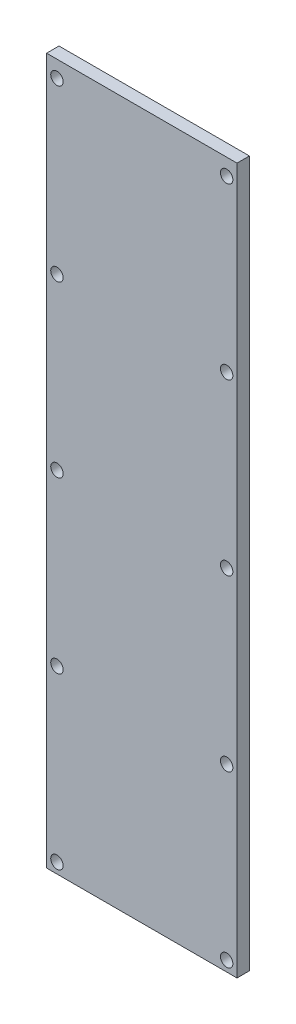
ISO-10303-21;
HEADER;
FILE_DESCRIPTION(('STEP AP214'),'2;1');
FILE_NAME('part.step','',(''),(''),'','','');
FILE_SCHEMA(('AUTOMOTIVE_DESIGN { 1 0 10303 214 1 1 1 1 }'));
ENDSEC;
DATA;
#1=APPLICATION_CONTEXT('core data for automotive mechanical design processes');
#2=APPLICATION_PROTOCOL_DEFINITION('international standard','automotive_design',2000,#1);
#3=PRODUCT_CONTEXT('',#1,'mechanical');
#4=PRODUCT('Part','Part','',(#3));
#5=PRODUCT_RELATED_PRODUCT_CATEGORY('part','',(#4));
#6=PRODUCT_DEFINITION_FORMATION('','',#4);
#7=PRODUCT_DEFINITION_CONTEXT('part definition',#1,'design');
#8=PRODUCT_DEFINITION('design','',#6,#7);
#9=PRODUCT_DEFINITION_SHAPE('','',#8);
#10=(LENGTH_UNIT() NAMED_UNIT(*) SI_UNIT(.MILLI.,.METRE.));
#11=(NAMED_UNIT(*) PLANE_ANGLE_UNIT() SI_UNIT($,.RADIAN.));
#12=(NAMED_UNIT(*) SI_UNIT($,.STERADIAN.) SOLID_ANGLE_UNIT());
#13=UNCERTAINTY_MEASURE_WITH_UNIT(LENGTH_MEASURE(1.E-05),#10,'distance_accuracy_value','');
#14=(GEOMETRIC_REPRESENTATION_CONTEXT(3) GLOBAL_UNCERTAINTY_ASSIGNED_CONTEXT((#13)) GLOBAL_UNIT_ASSIGNED_CONTEXT((#10,
#11,#12)) REPRESENTATION_CONTEXT('',''));
#15=CARTESIAN_POINT('',(0.,0.,0.));
#16=DIRECTION('',(0.,0.,1.));
#17=DIRECTION('',(1.,0.,0.));
#18=AXIS2_PLACEMENT_3D('',#15,#16,#17);
#19=CARTESIAN_POINT('',(0.,0.,0.));
#20=DIRECTION('',(0.,0.,1.));
#21=DIRECTION('',(1.,0.,0.));
#22=AXIS2_PLACEMENT_3D('',#19,#20,#21);
#23=PLANE('',#22);
#24=DIRECTION('',(1.,0.,0.));
#25=VECTOR('',#24,1.);
#26=CARTESIAN_POINT('',(0.,-13.,0.));
#27=LINE('',#26,#25);
#28=CARTESIAN_POINT('',(-40.,-13.,0.));
#29=VERTEX_POINT('',#28);
#30=CARTESIAN_POINT('',(6.,-13.,0.));
#31=VERTEX_POINT('',#30);
#32=EDGE_CURVE('E247',#29,#31,#27,.T.);
#33=ORIENTED_EDGE('',*,*,#32,.F.);
#34=DIRECTION('',(0.,1.,0.));
#35=VECTOR('',#34,1.);
#36=CARTESIAN_POINT('',(-40.,0.,0.));
#37=LINE('',#36,#35);
#38=CARTESIAN_POINT('',(-40.,157.5,0.));
#39=VERTEX_POINT('',#38);
#40=EDGE_CURVE('E179',#29,#39,#37,.T.);
#41=ORIENTED_EDGE('',*,*,#40,.T.);
#42=DIRECTION('',(1.,0.,0.));
#43=VECTOR('',#42,1.);
#44=CARTESIAN_POINT('',(0.,157.5,0.));
#45=LINE('',#44,#43);
#46=CARTESIAN_POINT('',(6.,157.5,0.));
#47=VERTEX_POINT('',#46);
#48=EDGE_CURVE('E253',#39,#47,#45,.T.);
#49=ORIENTED_EDGE('',*,*,#48,.T.);
#50=DIRECTION('',(0.,1.,0.));
#51=VECTOR('',#50,1.);
#52=CARTESIAN_POINT('',(6.,0.,0.));
#53=LINE('',#52,#51);
#54=EDGE_CURVE('E250',#31,#47,#53,.T.);
#55=ORIENTED_EDGE('',*,*,#54,.F.);
#56=EDGE_LOOP('',(#33,#41,#49,#55));
#57=FACE_BOUND('',#56,.T.);
#58=CARTESIAN_POINT('',(-37.5,-10.5000000000003,0.));
#59=DIRECTION('',(0.,0.,1.));
#60=DIRECTION('',(1.,0.,0.));
#61=AXIS2_PLACEMENT_3D('',#58,#59,#60);
#62=CIRCLE('',#61,1.5);
#63=CARTESIAN_POINT('',(-36.,-10.5000000000003,0.));
#64=VERTEX_POINT('',#63);
#65=EDGE_CURVE('E244',#64,#64,#62,.T.);
#66=ORIENTED_EDGE('',*,*,#65,.T.);
#67=EDGE_LOOP('',(#66));
#68=FACE_BOUND('',#67,.T.);
#69=CARTESIAN_POINT('',(3.5,-10.5000000000003,0.));
#70=DIRECTION('',(0.,0.,1.));
#71=DIRECTION('',(1.,0.,0.));
#72=AXIS2_PLACEMENT_3D('',#69,#70,#71);
#73=CIRCLE('',#72,1.5);
#74=CARTESIAN_POINT('',(5.00000000000001,-10.5000000000003,0.));
#75=VERTEX_POINT('',#74);
#76=EDGE_CURVE('E241',#75,#75,#73,.T.);
#77=ORIENTED_EDGE('',*,*,#76,.T.);
#78=EDGE_LOOP('',(#77));
#79=FACE_BOUND('',#78,.T.);
#80=CARTESIAN_POINT('',(3.49999999999986,30.4999999999997,0.));
#81=DIRECTION('',(0.,0.,1.));
#82=DIRECTION('',(1.,0.,0.));
#83=AXIS2_PLACEMENT_3D('',#80,#81,#82);
#84=CIRCLE('',#83,1.5);
#85=CARTESIAN_POINT('',(4.99999999999986,30.4999999999997,0.));
#86=VERTEX_POINT('',#85);
#87=EDGE_CURVE('E238',#86,#86,#84,.T.);
#88=ORIENTED_EDGE('',*,*,#87,.T.);
#89=EDGE_LOOP('',(#88));
#90=FACE_BOUND('',#89,.T.);
#91=CARTESIAN_POINT('',(3.49999999999972,71.4999999999997,0.));
#92=DIRECTION('',(0.,0.,1.));
#93=DIRECTION('',(1.,0.,0.));
#94=AXIS2_PLACEMENT_3D('',#91,#92,#93);
#95=CIRCLE('',#94,1.5);
#96=CARTESIAN_POINT('',(4.99999999999972,71.4999999999997,0.));
#97=VERTEX_POINT('',#96);
#98=EDGE_CURVE('E235',#97,#97,#95,.T.);
#99=ORIENTED_EDGE('',*,*,#98,.T.);
#100=EDGE_LOOP('',(#99));
#101=FACE_BOUND('',#100,.T.);
#102=CARTESIAN_POINT('',(3.49999999999957,112.5,0.));
#103=DIRECTION('',(0.,0.,1.));
#104=DIRECTION('',(1.,0.,0.));
#105=AXIS2_PLACEMENT_3D('',#102,#103,#104);
#106=CIRCLE('',#105,1.5);
#107=CARTESIAN_POINT('',(4.99999999999958,112.5,0.));
#108=VERTEX_POINT('',#107);
#109=EDGE_CURVE('E232',#108,#108,#106,.T.);
#110=ORIENTED_EDGE('',*,*,#109,.T.);
#111=EDGE_LOOP('',(#110));
#112=FACE_BOUND('',#111,.T.);
#113=CARTESIAN_POINT('',(3.49999999999943,153.5,0.));
#114=DIRECTION('',(0.,0.,1.));
#115=DIRECTION('',(1.,0.,0.));
#116=AXIS2_PLACEMENT_3D('',#113,#114,#115);
#117=CIRCLE('',#116,1.5);
#118=CARTESIAN_POINT('',(4.99999999999943,153.5,0.));
#119=VERTEX_POINT('',#118);
#120=EDGE_CURVE('E229',#119,#119,#117,.T.);
#121=ORIENTED_EDGE('',*,*,#120,.T.);
#122=EDGE_LOOP('',(#121));
#123=FACE_BOUND('',#122,.T.);
#124=CARTESIAN_POINT('',(-37.5000000000001,30.4999999999997,0.));
#125=DIRECTION('',(0.,0.,1.));
#126=DIRECTION('',(1.,0.,0.));
#127=AXIS2_PLACEMENT_3D('',#124,#125,#126);
#128=CIRCLE('',#127,1.5);
#129=CARTESIAN_POINT('',(-36.0000000000001,30.4999999999997,0.));
#130=VERTEX_POINT('',#129);
#131=EDGE_CURVE('E226',#130,#130,#128,.T.);
#132=ORIENTED_EDGE('',*,*,#131,.T.);
#133=EDGE_LOOP('',(#132));
#134=FACE_BOUND('',#133,.T.);
#135=CARTESIAN_POINT('',(-37.5000000000003,71.4999999999997,0.));
#136=DIRECTION('',(0.,0.,1.));
#137=DIRECTION('',(1.,0.,0.));
#138=AXIS2_PLACEMENT_3D('',#135,#136,#137);
#139=CIRCLE('',#138,1.5);
#140=CARTESIAN_POINT('',(-36.0000000000003,71.4999999999997,0.));
#141=VERTEX_POINT('',#140);
#142=EDGE_CURVE('E223',#141,#141,#139,.T.);
#143=ORIENTED_EDGE('',*,*,#142,.T.);
#144=EDGE_LOOP('',(#143));
#145=FACE_BOUND('',#144,.T.);
#146=CARTESIAN_POINT('',(-37.5000000000004,112.5,0.));
#147=DIRECTION('',(0.,0.,1.));
#148=DIRECTION('',(1.,0.,0.));
#149=AXIS2_PLACEMENT_3D('',#146,#147,#148);
#150=CIRCLE('',#149,1.5);
#151=CARTESIAN_POINT('',(-36.0000000000004,112.5,0.));
#152=VERTEX_POINT('',#151);
#153=EDGE_CURVE('E220',#152,#152,#150,.T.);
#154=ORIENTED_EDGE('',*,*,#153,.T.);
#155=EDGE_LOOP('',(#154));
#156=FACE_BOUND('',#155,.T.);
#157=CARTESIAN_POINT('',(-37.5000000000006,153.5,0.));
#158=DIRECTION('',(0.,0.,1.));
#159=DIRECTION('',(1.,0.,0.));
#160=AXIS2_PLACEMENT_3D('',#157,#158,#159);
#161=CIRCLE('',#160,1.5);
#162=CARTESIAN_POINT('',(-36.0000000000006,153.5,0.));
#163=VERTEX_POINT('',#162);
#164=EDGE_CURVE('E162',#163,#163,#161,.T.);
#165=ORIENTED_EDGE('',*,*,#164,.T.);
#166=EDGE_LOOP('',(#165));
#167=FACE_BOUND('',#166,.T.);
#168=DIRECTION('',(-1.,0.,0.));
#169=VECTOR('',#168,1.);
#170=CARTESIAN_POINT('',(0.,-8.,0.));
#171=LINE('',#170,#169);
#172=CARTESIAN_POINT('',(1.,-8.,0.));
#173=VERTEX_POINT('',#172);
#174=CARTESIAN_POINT('',(-35.,-8.,0.));
#175=VERTEX_POINT('',#174);
#176=EDGE_CURVE('E11',#173,#175,#171,.T.);
#177=ORIENTED_EDGE('',*,*,#176,.F.);
#178=DIRECTION('',(0.,1.,0.));
#179=VECTOR('',#178,1.);
#180=CARTESIAN_POINT('',(1.,0.,0.));
#181=LINE('',#180,#179);
#182=CARTESIAN_POINT('',(1.,152.5,0.));
#183=VERTEX_POINT('',#182);
#184=EDGE_CURVE('E127',#173,#183,#181,.T.);
#185=ORIENTED_EDGE('',*,*,#184,.T.);
#186=DIRECTION('',(-1.,0.,0.));
#187=VECTOR('',#186,1.);
#188=CARTESIAN_POINT('',(0.,152.5,0.));
#189=LINE('',#188,#187);
#190=CARTESIAN_POINT('',(-35.,152.5,0.));
#191=VERTEX_POINT('',#190);
#192=EDGE_CURVE('E277',#183,#191,#189,.T.);
#193=ORIENTED_EDGE('',*,*,#192,.T.);
#194=DIRECTION('',(0.,1.,0.));
#195=VECTOR('',#194,1.);
#196=CARTESIAN_POINT('',(-35.,0.,0.));
#197=LINE('',#196,#195);
#198=EDGE_CURVE('E43',#175,#191,#197,.T.);
#199=ORIENTED_EDGE('',*,*,#198,.F.);
#200=EDGE_LOOP('',(#177,#185,#193,#199));
#201=FACE_BOUND('',#200,.T.);
#202=ADVANCED_FACE('F35',(#57,#68,#79,#90,#101,#112,#123,#134,#145,#156,#167,#201),#23,.F.);
#203=CARTESIAN_POINT('',(0.,-13.,3.));
#204=DIRECTION('',(0.,1.,0.));
#205=DIRECTION('',(0.,0.,1.));
#206=AXIS2_PLACEMENT_3D('',#203,#204,#205);
#207=PLANE('',#206);
#208=ORIENTED_EDGE('',*,*,#32,.T.);
#209=DIRECTION('',(0.,0.,-1.));
#210=VECTOR('',#209,1.);
#211=CARTESIAN_POINT('',(6.,-13.,3.));
#212=LINE('',#211,#210);
#213=CARTESIAN_POINT('',(6.,-13.,3.));
#214=VERTEX_POINT('',#213);
#215=EDGE_CURVE('E263',#214,#31,#212,.T.);
#216=ORIENTED_EDGE('',*,*,#215,.F.);
#217=DIRECTION('',(1.,0.,0.));
#218=VECTOR('',#217,1.);
#219=CARTESIAN_POINT('',(0.,-13.,3.));
#220=LINE('',#219,#218);
#221=CARTESIAN_POINT('',(-40.,-13.,3.));
#222=VERTEX_POINT('',#221);
#223=EDGE_CURVE('E206',#222,#214,#220,.T.);
#224=ORIENTED_EDGE('',*,*,#223,.F.);
#225=DIRECTION('',(0.,0.,-1.));
#226=VECTOR('',#225,1.);
#227=CARTESIAN_POINT('',(-40.,-13.,3.));
#228=LINE('',#227,#226);
#229=EDGE_CURVE('E217',#222,#29,#228,.T.);
#230=ORIENTED_EDGE('',*,*,#229,.T.);
#231=EDGE_LOOP('',(#208,#216,#224,#230));
#232=FACE_BOUND('',#231,.T.);
#233=ADVANCED_FACE('F287',(#232),#207,.F.);
#234=CARTESIAN_POINT('',(6.,0.,3.));
#235=DIRECTION('',(-1.,0.,0.));
#236=DIRECTION('',(0.,0.,1.));
#237=AXIS2_PLACEMENT_3D('',#234,#235,#236);
#238=PLANE('',#237);
#239=ORIENTED_EDGE('',*,*,#54,.T.);
#240=DIRECTION('',(0.,0.,-1.));
#241=VECTOR('',#240,1.);
#242=CARTESIAN_POINT('',(6.,157.5,3.));
#243=LINE('',#242,#241);
#244=CARTESIAN_POINT('',(6.,157.5,3.));
#245=VERTEX_POINT('',#244);
#246=EDGE_CURVE('E261',#245,#47,#243,.T.);
#247=ORIENTED_EDGE('',*,*,#246,.F.);
#248=DIRECTION('',(0.,1.,0.));
#249=VECTOR('',#248,1.);
#250=CARTESIAN_POINT('',(6.,0.,3.));
#251=LINE('',#250,#249);
#252=EDGE_CURVE('E209',#214,#245,#251,.T.);
#253=ORIENTED_EDGE('',*,*,#252,.F.);
#254=ORIENTED_EDGE('',*,*,#215,.T.);
#255=EDGE_LOOP('',(#239,#247,#253,#254));
#256=FACE_BOUND('',#255,.T.);
#257=ADVANCED_FACE('F294',(#256),#238,.F.);
#258=CARTESIAN_POINT('',(0.,157.5,3.));
#259=DIRECTION('',(0.,1.,0.));
#260=DIRECTION('',(0.,0.,1.));
#261=AXIS2_PLACEMENT_3D('',#258,#259,#260);
#262=PLANE('',#261);
#263=ORIENTED_EDGE('',*,*,#48,.F.);
#264=DIRECTION('',(0.,0.,-1.));
#265=VECTOR('',#264,1.);
#266=CARTESIAN_POINT('',(-40.,157.5,3.));
#267=LINE('',#266,#265);
#268=CARTESIAN_POINT('',(-40.,157.5,3.));
#269=VERTEX_POINT('',#268);
#270=EDGE_CURVE('E259',#269,#39,#267,.T.);
#271=ORIENTED_EDGE('',*,*,#270,.F.);
#272=DIRECTION('',(1.,0.,0.));
#273=VECTOR('',#272,1.);
#274=CARTESIAN_POINT('',(0.,157.5,3.));
#275=LINE('',#274,#273);
#276=EDGE_CURVE('E211',#269,#245,#275,.T.);
#277=ORIENTED_EDGE('',*,*,#276,.T.);
#278=ORIENTED_EDGE('',*,*,#246,.T.);
#279=EDGE_LOOP('',(#263,#271,#277,#278));
#280=FACE_BOUND('',#279,.T.);
#281=ADVANCED_FACE('F411',(#280),#262,.T.);
#282=CARTESIAN_POINT('',(-37.5,-10.5000000000003,3.));
#283=DIRECTION('',(0.,0.,-1.));
#284=DIRECTION('',(-1.,0.,0.));
#285=AXIS2_PLACEMENT_3D('',#282,#283,#284);
#286=CYLINDRICAL_SURFACE('',#285,1.5);
#287=CARTESIAN_POINT('',(-37.5,-10.5000000000003,3.));
#288=DIRECTION('',(0.,0.,1.));
#289=DIRECTION('',(1.,0.,0.));
#290=AXIS2_PLACEMENT_3D('',#287,#288,#289);
#291=CIRCLE('',#290,1.5);
#292=CARTESIAN_POINT('',(-36.,-10.5000000000003,3.));
#293=VERTEX_POINT('',#292);
#294=EDGE_CURVE('E203',#293,#293,#291,.T.);
#295=ORIENTED_EDGE('',*,*,#294,.T.);
#296=EDGE_LOOP('',(#295));
#297=FACE_BOUND('',#296,.T.);
#298=ORIENTED_EDGE('',*,*,#65,.F.);
#299=EDGE_LOOP('',(#298));
#300=FACE_BOUND('',#299,.T.);
#301=ADVANCED_FACE('F408',(#297,#300),#286,.F.);
#302=CARTESIAN_POINT('',(3.5,-10.5000000000003,3.));
#303=DIRECTION('',(0.,0.,-1.));
#304=DIRECTION('',(-1.,0.,0.));
#305=AXIS2_PLACEMENT_3D('',#302,#303,#304);
#306=CYLINDRICAL_SURFACE('',#305,1.5);
#307=CARTESIAN_POINT('',(3.5,-10.5000000000003,3.));
#308=DIRECTION('',(0.,0.,1.));
#309=DIRECTION('',(1.,0.,0.));
#310=AXIS2_PLACEMENT_3D('',#307,#308,#309);
#311=CIRCLE('',#310,1.5);
#312=CARTESIAN_POINT('',(5.00000000000001,-10.5000000000003,3.));
#313=VERTEX_POINT('',#312);
#314=EDGE_CURVE('E200',#313,#313,#311,.T.);
#315=ORIENTED_EDGE('',*,*,#314,.T.);
#316=EDGE_LOOP('',(#315));
#317=FACE_BOUND('',#316,.T.);
#318=ORIENTED_EDGE('',*,*,#76,.F.);
#319=EDGE_LOOP('',(#318));
#320=FACE_BOUND('',#319,.T.);
#321=ADVANCED_FACE('F404',(#317,#320),#306,.F.);
#322=CARTESIAN_POINT('',(3.49999999999986,30.4999999999997,3.));
#323=DIRECTION('',(0.,0.,-1.));
#324=DIRECTION('',(-1.,0.,0.));
#325=AXIS2_PLACEMENT_3D('',#322,#323,#324);
#326=CYLINDRICAL_SURFACE('',#325,1.5);
#327=CARTESIAN_POINT('',(3.49999999999986,30.4999999999997,3.));
#328=DIRECTION('',(0.,0.,1.));
#329=DIRECTION('',(1.,0.,0.));
#330=AXIS2_PLACEMENT_3D('',#327,#328,#329);
#331=CIRCLE('',#330,1.5);
#332=CARTESIAN_POINT('',(4.99999999999986,30.4999999999997,3.));
#333=VERTEX_POINT('',#332);
#334=EDGE_CURVE('E197',#333,#333,#331,.T.);
#335=ORIENTED_EDGE('',*,*,#334,.T.);
#336=EDGE_LOOP('',(#335));
#337=FACE_BOUND('',#336,.T.);
#338=ORIENTED_EDGE('',*,*,#87,.F.);
#339=EDGE_LOOP('',(#338));
#340=FACE_BOUND('',#339,.T.);
#341=ADVANCED_FACE('F400',(#337,#340),#326,.F.);
#342=CARTESIAN_POINT('',(3.49999999999972,71.4999999999997,3.));
#343=DIRECTION('',(0.,0.,-1.));
#344=DIRECTION('',(-1.,0.,0.));
#345=AXIS2_PLACEMENT_3D('',#342,#343,#344);
#346=CYLINDRICAL_SURFACE('',#345,1.5);
#347=CARTESIAN_POINT('',(3.49999999999972,71.4999999999997,3.));
#348=DIRECTION('',(0.,0.,1.));
#349=DIRECTION('',(1.,0.,0.));
#350=AXIS2_PLACEMENT_3D('',#347,#348,#349);
#351=CIRCLE('',#350,1.5);
#352=CARTESIAN_POINT('',(4.99999999999972,71.4999999999997,3.));
#353=VERTEX_POINT('',#352);
#354=EDGE_CURVE('E194',#353,#353,#351,.T.);
#355=ORIENTED_EDGE('',*,*,#354,.T.);
#356=EDGE_LOOP('',(#355));
#357=FACE_BOUND('',#356,.T.);
#358=ORIENTED_EDGE('',*,*,#98,.F.);
#359=EDGE_LOOP('',(#358));
#360=FACE_BOUND('',#359,.T.);
#361=ADVANCED_FACE('F396',(#357,#360),#346,.F.);
#362=CARTESIAN_POINT('',(3.49999999999957,112.5,3.));
#363=DIRECTION('',(0.,0.,-1.));
#364=DIRECTION('',(-1.,0.,0.));
#365=AXIS2_PLACEMENT_3D('',#362,#363,#364);
#366=CYLINDRICAL_SURFACE('',#365,1.5);
#367=CARTESIAN_POINT('',(3.49999999999957,112.5,3.));
#368=DIRECTION('',(0.,0.,1.));
#369=DIRECTION('',(1.,0.,0.));
#370=AXIS2_PLACEMENT_3D('',#367,#368,#369);
#371=CIRCLE('',#370,1.5);
#372=CARTESIAN_POINT('',(4.99999999999958,112.5,3.));
#373=VERTEX_POINT('',#372);
#374=EDGE_CURVE('E191',#373,#373,#371,.T.);
#375=ORIENTED_EDGE('',*,*,#374,.T.);
#376=EDGE_LOOP('',(#375));
#377=FACE_BOUND('',#376,.T.);
#378=ORIENTED_EDGE('',*,*,#109,.F.);
#379=EDGE_LOOP('',(#378));
#380=FACE_BOUND('',#379,.T.);
#381=ADVANCED_FACE('F392',(#377,#380),#366,.F.);
#382=CARTESIAN_POINT('',(3.49999999999943,153.5,3.));
#383=DIRECTION('',(0.,0.,-1.));
#384=DIRECTION('',(-1.,0.,0.));
#385=AXIS2_PLACEMENT_3D('',#382,#383,#384);
#386=CYLINDRICAL_SURFACE('',#385,1.5);
#387=CARTESIAN_POINT('',(3.49999999999943,153.5,3.));
#388=DIRECTION('',(0.,0.,1.));
#389=DIRECTION('',(1.,0.,0.));
#390=AXIS2_PLACEMENT_3D('',#387,#388,#389);
#391=CIRCLE('',#390,1.5);
#392=CARTESIAN_POINT('',(4.99999999999943,153.5,3.));
#393=VERTEX_POINT('',#392);
#394=EDGE_CURVE('E188',#393,#393,#391,.T.);
#395=ORIENTED_EDGE('',*,*,#394,.T.);
#396=EDGE_LOOP('',(#395));
#397=FACE_BOUND('',#396,.T.);
#398=ORIENTED_EDGE('',*,*,#120,.F.);
#399=EDGE_LOOP('',(#398));
#400=FACE_BOUND('',#399,.T.);
#401=ADVANCED_FACE('F388',(#397,#400),#386,.F.);
#402=CARTESIAN_POINT('',(-37.5000000000001,30.4999999999997,3.));
#403=DIRECTION('',(0.,0.,-1.));
#404=DIRECTION('',(-1.,0.,0.));
#405=AXIS2_PLACEMENT_3D('',#402,#403,#404);
#406=CYLINDRICAL_SURFACE('',#405,1.5);
#407=CARTESIAN_POINT('',(-37.5000000000001,30.4999999999997,3.));
#408=DIRECTION('',(0.,0.,1.));
#409=DIRECTION('',(1.,0.,0.));
#410=AXIS2_PLACEMENT_3D('',#407,#408,#409);
#411=CIRCLE('',#410,1.5);
#412=CARTESIAN_POINT('',(-36.0000000000001,30.4999999999997,3.));
#413=VERTEX_POINT('',#412);
#414=EDGE_CURVE('E185',#413,#413,#411,.T.);
#415=ORIENTED_EDGE('',*,*,#414,.T.);
#416=EDGE_LOOP('',(#415));
#417=FACE_BOUND('',#416,.T.);
#418=ORIENTED_EDGE('',*,*,#131,.F.);
#419=EDGE_LOOP('',(#418));
#420=FACE_BOUND('',#419,.T.);
#421=ADVANCED_FACE('F381',(#417,#420),#406,.F.);
#422=CARTESIAN_POINT('',(-37.5000000000003,71.4999999999997,3.));
#423=DIRECTION('',(0.,0.,-1.));
#424=DIRECTION('',(-1.,0.,0.));
#425=AXIS2_PLACEMENT_3D('',#422,#423,#424);
#426=CYLINDRICAL_SURFACE('',#425,1.5);
#427=CARTESIAN_POINT('',(-37.5000000000003,71.4999999999997,3.));
#428=DIRECTION('',(0.,0.,1.));
#429=DIRECTION('',(1.,0.,0.));
#430=AXIS2_PLACEMENT_3D('',#427,#428,#429);
#431=CIRCLE('',#430,1.5);
#432=CARTESIAN_POINT('',(-36.0000000000003,71.4999999999997,3.));
#433=VERTEX_POINT('',#432);
#434=EDGE_CURVE('E182',#433,#433,#431,.T.);
#435=ORIENTED_EDGE('',*,*,#434,.T.);
#436=EDGE_LOOP('',(#435));
#437=FACE_BOUND('',#436,.T.);
#438=ORIENTED_EDGE('',*,*,#142,.F.);
#439=EDGE_LOOP('',(#438));
#440=FACE_BOUND('',#439,.T.);
#441=ADVANCED_FACE('F376',(#437,#440),#426,.F.);
#442=CARTESIAN_POINT('',(-37.5000000000004,112.5,3.));
#443=DIRECTION('',(0.,0.,-1.));
#444=DIRECTION('',(-1.,0.,0.));
#445=AXIS2_PLACEMENT_3D('',#442,#443,#444);
#446=CYLINDRICAL_SURFACE('',#445,1.5);
#447=CARTESIAN_POINT('',(-37.5000000000004,112.5,3.));
#448=DIRECTION('',(0.,0.,1.));
#449=DIRECTION('',(1.,0.,0.));
#450=AXIS2_PLACEMENT_3D('',#447,#448,#449);
#451=CIRCLE('',#450,1.5);
#452=CARTESIAN_POINT('',(-36.0000000000004,112.5,3.));
#453=VERTEX_POINT('',#452);
#454=EDGE_CURVE('E178',#453,#453,#451,.T.);
#455=ORIENTED_EDGE('',*,*,#454,.T.);
#456=EDGE_LOOP('',(#455));
#457=FACE_BOUND('',#456,.T.);
#458=ORIENTED_EDGE('',*,*,#153,.F.);
#459=EDGE_LOOP('',(#458));
#460=FACE_BOUND('',#459,.T.);
#461=ADVANCED_FACE('F370',(#457,#460),#446,.F.);
#462=CARTESIAN_POINT('',(-37.5000000000006,153.5,3.));
#463=DIRECTION('',(0.,0.,-1.));
#464=DIRECTION('',(-1.,0.,0.));
#465=AXIS2_PLACEMENT_3D('',#462,#463,#464);
#466=CYLINDRICAL_SURFACE('',#465,1.5);
#467=CARTESIAN_POINT('',(-37.5000000000006,153.5,3.));
#468=DIRECTION('',(0.,0.,1.));
#469=DIRECTION('',(1.,0.,0.));
#470=AXIS2_PLACEMENT_3D('',#467,#468,#469);
#471=CIRCLE('',#470,1.5);
#472=CARTESIAN_POINT('',(-36.0000000000006,153.5,3.));
#473=VERTEX_POINT('',#472);
#474=EDGE_CURVE('E175',#473,#473,#471,.T.);
#475=ORIENTED_EDGE('',*,*,#474,.T.);
#476=EDGE_LOOP('',(#475));
#477=FACE_BOUND('',#476,.T.);
#478=ORIENTED_EDGE('',*,*,#164,.F.);
#479=EDGE_LOOP('',(#478));
#480=FACE_BOUND('',#479,.T.);
#481=ADVANCED_FACE('F37',(#477,#480),#466,.F.);
#482=CARTESIAN_POINT('',(-40.,0.,3.));
#483=DIRECTION('',(-1.,0.,0.));
#484=DIRECTION('',(0.,0.,1.));
#485=AXIS2_PLACEMENT_3D('',#482,#483,#484);
#486=PLANE('',#485);
#487=ORIENTED_EDGE('',*,*,#40,.F.);
#488=ORIENTED_EDGE('',*,*,#229,.F.);
#489=DIRECTION('',(0.,1.,0.));
#490=VECTOR('',#489,1.);
#491=CARTESIAN_POINT('',(-40.,0.,3.));
#492=LINE('',#491,#490);
#493=EDGE_CURVE('E214',#222,#269,#492,.T.);
#494=ORIENTED_EDGE('',*,*,#493,.T.);
#495=ORIENTED_EDGE('',*,*,#270,.T.);
#496=EDGE_LOOP('',(#487,#488,#494,#495));
#497=FACE_BOUND('',#496,.T.);
#498=ADVANCED_FACE('F338',(#497),#486,.T.);
#499=CARTESIAN_POINT('',(0.,0.,3.));
#500=DIRECTION('',(0.,0.,1.));
#501=DIRECTION('',(1.,0.,0.));
#502=AXIS2_PLACEMENT_3D('',#499,#500,#501);
#503=PLANE('',#502);
#504=ORIENTED_EDGE('',*,*,#223,.T.);
#505=ORIENTED_EDGE('',*,*,#252,.T.);
#506=ORIENTED_EDGE('',*,*,#276,.F.);
#507=ORIENTED_EDGE('',*,*,#493,.F.);
#508=EDGE_LOOP('',(#504,#505,#506,#507));
#509=FACE_BOUND('',#508,.T.);
#510=ORIENTED_EDGE('',*,*,#294,.F.);
#511=EDGE_LOOP('',(#510));
#512=FACE_BOUND('',#511,.T.);
#513=ORIENTED_EDGE('',*,*,#314,.F.);
#514=EDGE_LOOP('',(#513));
#515=FACE_BOUND('',#514,.T.);
#516=ORIENTED_EDGE('',*,*,#334,.F.);
#517=EDGE_LOOP('',(#516));
#518=FACE_BOUND('',#517,.T.);
#519=ORIENTED_EDGE('',*,*,#354,.F.);
#520=EDGE_LOOP('',(#519));
#521=FACE_BOUND('',#520,.T.);
#522=ORIENTED_EDGE('',*,*,#374,.F.);
#523=EDGE_LOOP('',(#522));
#524=FACE_BOUND('',#523,.T.);
#525=ORIENTED_EDGE('',*,*,#394,.F.);
#526=EDGE_LOOP('',(#525));
#527=FACE_BOUND('',#526,.T.);
#528=ORIENTED_EDGE('',*,*,#414,.F.);
#529=EDGE_LOOP('',(#528));
#530=FACE_BOUND('',#529,.T.);
#531=ORIENTED_EDGE('',*,*,#434,.F.);
#532=EDGE_LOOP('',(#531));
#533=FACE_BOUND('',#532,.T.);
#534=ORIENTED_EDGE('',*,*,#454,.F.);
#535=EDGE_LOOP('',(#534));
#536=FACE_BOUND('',#535,.T.);
#537=ORIENTED_EDGE('',*,*,#474,.F.);
#538=EDGE_LOOP('',(#537));
#539=FACE_BOUND('',#538,.T.);
#540=ADVANCED_FACE('F331',(#509,#512,#515,#518,#521,#524,#527,#530,#533,#536,#539),#503,.T.);
#541=CARTESIAN_POINT('',(0.,0.,-3.));
#542=DIRECTION('',(1.,0.,0.));
#543=DIRECTION('',(0.,0.,-1.));
#544=AXIS2_PLACEMENT_3D('',#541,#542,#543);
#545=PLANE('',#544);
#546=DIRECTION('',(0.,0.,1.));
#547=VECTOR('',#546,1.);
#548=CARTESIAN_POINT('',(0.,-7.,-3.));
#549=LINE('',#548,#547);
#550=CARTESIAN_POINT('',(0.,-7.,-3.));
#551=VERTEX_POINT('',#550);
#552=CARTESIAN_POINT('',(0.,-7.,0.));
#553=VERTEX_POINT('',#552);
#554=EDGE_CURVE('E167',#551,#553,#549,.T.);
#555=ORIENTED_EDGE('',*,*,#554,.T.);
#556=DIRECTION('',(0.,1.,0.));
#557=VECTOR('',#556,1.);
#558=CARTESIAN_POINT('',(0.,0.,0.));
#559=LINE('',#558,#557);
#560=CARTESIAN_POINT('',(0.,151.5,0.));
#561=VERTEX_POINT('',#560);
#562=EDGE_CURVE('E274',#553,#561,#559,.T.);
#563=ORIENTED_EDGE('',*,*,#562,.T.);
#564=DIRECTION('',(0.,0.,1.));
#565=VECTOR('',#564,1.);
#566=CARTESIAN_POINT('',(0.,151.5,-3.));
#567=LINE('',#566,#565);
#568=CARTESIAN_POINT('',(0.,151.5,-3.));
#569=VERTEX_POINT('',#568);
#570=EDGE_CURVE('E159',#569,#561,#567,.T.);
#571=ORIENTED_EDGE('',*,*,#570,.F.);
#572=DIRECTION('',(0.,1.,0.));
#573=VECTOR('',#572,1.);
#574=CARTESIAN_POINT('',(0.,0.,-3.));
#575=LINE('',#574,#573);
#576=EDGE_CURVE('E150',#551,#569,#575,.T.);
#577=ORIENTED_EDGE('',*,*,#576,.F.);
#578=EDGE_LOOP('',(#555,#563,#571,#577));
#579=FACE_BOUND('',#578,.T.);
#580=ADVANCED_FACE('F312',(#579),#545,.F.);
#581=CARTESIAN_POINT('',(0.,151.5,-3.));
#582=DIRECTION('',(0.,1.,0.));
#583=DIRECTION('',(0.,0.,1.));
#584=AXIS2_PLACEMENT_3D('',#581,#582,#583);
#585=PLANE('',#584);
#586=ORIENTED_EDGE('',*,*,#570,.T.);
#587=DIRECTION('',(-1.,0.,0.));
#588=VECTOR('',#587,1.);
#589=CARTESIAN_POINT('',(0.,151.5,0.));
#590=LINE('',#589,#588);
#591=CARTESIAN_POINT('',(-34.,151.5,0.));
#592=VERTEX_POINT('',#591);
#593=EDGE_CURVE('E272',#561,#592,#590,.T.);
#594=ORIENTED_EDGE('',*,*,#593,.T.);
#595=DIRECTION('',(0.,0.,1.));
#596=VECTOR('',#595,1.);
#597=CARTESIAN_POINT('',(-34.,151.5,-3.));
#598=LINE('',#597,#596);
#599=CARTESIAN_POINT('',(-34.,151.5,-3.));
#600=VERTEX_POINT('',#599);
#601=EDGE_CURVE('E163',#600,#592,#598,.T.);
#602=ORIENTED_EDGE('',*,*,#601,.F.);
#603=DIRECTION('',(-1.,0.,0.));
#604=VECTOR('',#603,1.);
#605=CARTESIAN_POINT('',(0.,151.5,-3.));
#606=LINE('',#605,#604);
#607=EDGE_CURVE('E130',#569,#600,#606,.T.);
#608=ORIENTED_EDGE('',*,*,#607,.F.);
#609=EDGE_LOOP('',(#586,#594,#602,#608));
#610=FACE_BOUND('',#609,.T.);
#611=ADVANCED_FACE('F315',(#610),#585,.F.);
#612=CARTESIAN_POINT('',(-34.,0.,-3.));
#613=DIRECTION('',(1.,0.,0.));
#614=DIRECTION('',(0.,0.,-1.));
#615=AXIS2_PLACEMENT_3D('',#612,#613,#614);
#616=PLANE('',#615);
#617=DIRECTION('',(0.,1.,0.));
#618=VECTOR('',#617,1.);
#619=CARTESIAN_POINT('',(-34.,0.,0.));
#620=LINE('',#619,#618);
#621=CARTESIAN_POINT('',(-34.,-7.,0.));
#622=VERTEX_POINT('',#621);
#623=EDGE_CURVE('E269',#622,#592,#620,.T.);
#624=ORIENTED_EDGE('',*,*,#623,.F.);
#625=DIRECTION('',(0.,0.,1.));
#626=VECTOR('',#625,1.);
#627=CARTESIAN_POINT('',(-34.,-7.,-3.));
#628=LINE('',#627,#626);
#629=CARTESIAN_POINT('',(-34.,-7.,-3.));
#630=VERTEX_POINT('',#629);
#631=EDGE_CURVE('E58',#630,#622,#628,.T.);
#632=ORIENTED_EDGE('',*,*,#631,.F.);
#633=DIRECTION('',(0.,1.,0.));
#634=VECTOR('',#633,1.);
#635=CARTESIAN_POINT('',(-34.,0.,-3.));
#636=LINE('',#635,#634);
#637=EDGE_CURVE('E155',#630,#600,#636,.T.);
#638=ORIENTED_EDGE('',*,*,#637,.T.);
#639=ORIENTED_EDGE('',*,*,#601,.T.);
#640=EDGE_LOOP('',(#624,#632,#638,#639));
#641=FACE_BOUND('',#640,.T.);
#642=ADVANCED_FACE('F327',(#641),#616,.T.);
#643=CARTESIAN_POINT('',(0.,-8.,-3.));
#644=DIRECTION('',(0.,1.,0.));
#645=DIRECTION('',(0.,0.,1.));
#646=AXIS2_PLACEMENT_3D('',#643,#644,#645);
#647=PLANE('',#646);
#648=DIRECTION('',(0.,0.,1.));
#649=VECTOR('',#648,1.);
#650=CARTESIAN_POINT('',(1.,-8.,-3.));
#651=LINE('',#650,#649);
#652=CARTESIAN_POINT('',(1.,-8.,-3.));
#653=VERTEX_POINT('',#652);
#654=EDGE_CURVE('E121',#653,#173,#651,.T.);
#655=ORIENTED_EDGE('',*,*,#654,.T.);
#656=ORIENTED_EDGE('',*,*,#176,.T.);
#657=DIRECTION('',(0.,0.,1.));
#658=VECTOR('',#657,1.);
#659=CARTESIAN_POINT('',(-35.,-8.,-3.));
#660=LINE('',#659,#658);
#661=CARTESIAN_POINT('',(-35.,-8.,-3.));
#662=VERTEX_POINT('',#661);
#663=EDGE_CURVE('E137',#662,#175,#660,.T.);
#664=ORIENTED_EDGE('',*,*,#663,.F.);
#665=DIRECTION('',(-1.,0.,0.));
#666=VECTOR('',#665,1.);
#667=CARTESIAN_POINT('',(0.,-8.,-3.));
#668=LINE('',#667,#666);
#669=EDGE_CURVE('E134',#653,#662,#668,.T.);
#670=ORIENTED_EDGE('',*,*,#669,.F.);
#671=EDGE_LOOP('',(#655,#656,#664,#670));
#672=FACE_BOUND('',#671,.T.);
#673=ADVANCED_FACE('F135',(#672),#647,.F.);
#674=CARTESIAN_POINT('',(-35.,0.,-3.));
#675=DIRECTION('',(1.,0.,0.));
#676=DIRECTION('',(0.,0.,-1.));
#677=AXIS2_PLACEMENT_3D('',#674,#675,#676);
#678=PLANE('',#677);
#679=ORIENTED_EDGE('',*,*,#663,.T.);
#680=ORIENTED_EDGE('',*,*,#198,.T.);
#681=DIRECTION('',(0.,0.,1.));
#682=VECTOR('',#681,1.);
#683=CARTESIAN_POINT('',(-35.,152.5,-3.));
#684=LINE('',#683,#682);
#685=CARTESIAN_POINT('',(-35.,152.5,-3.));
#686=VERTEX_POINT('',#685);
#687=EDGE_CURVE('E171',#686,#191,#684,.T.);
#688=ORIENTED_EDGE('',*,*,#687,.F.);
#689=DIRECTION('',(0.,1.,0.));
#690=VECTOR('',#689,1.);
#691=CARTESIAN_POINT('',(-35.,0.,-3.));
#692=LINE('',#691,#690);
#693=EDGE_CURVE('E146',#662,#686,#692,.T.);
#694=ORIENTED_EDGE('',*,*,#693,.F.);
#695=EDGE_LOOP('',(#679,#680,#688,#694));
#696=FACE_BOUND('',#695,.T.);
#697=ADVANCED_FACE('F282',(#696),#678,.F.);
#698=CARTESIAN_POINT('',(0.,152.5,-3.));
#699=DIRECTION('',(0.,1.,0.));
#700=DIRECTION('',(0.,0.,1.));
#701=AXIS2_PLACEMENT_3D('',#698,#699,#700);
#702=PLANE('',#701);
#703=ORIENTED_EDGE('',*,*,#192,.F.);
#704=DIRECTION('',(0.,0.,1.));
#705=VECTOR('',#704,1.);
#706=CARTESIAN_POINT('',(1.,152.5,-3.));
#707=LINE('',#706,#705);
#708=CARTESIAN_POINT('',(1.,152.5,-3.));
#709=VERTEX_POINT('',#708);
#710=EDGE_CURVE('E50',#709,#183,#707,.T.);
#711=ORIENTED_EDGE('',*,*,#710,.F.);
#712=DIRECTION('',(-1.,0.,0.));
#713=VECTOR('',#712,1.);
#714=CARTESIAN_POINT('',(0.,152.5,-3.));
#715=LINE('',#714,#713);
#716=EDGE_CURVE('E144',#709,#686,#715,.T.);
#717=ORIENTED_EDGE('',*,*,#716,.T.);
#718=ORIENTED_EDGE('',*,*,#687,.T.);
#719=EDGE_LOOP('',(#703,#711,#717,#718));
#720=FACE_BOUND('',#719,.T.);
#721=ADVANCED_FACE('F285',(#720),#702,.T.);
#722=CARTESIAN_POINT('',(1.,0.,-3.));
#723=DIRECTION('',(1.,0.,0.));
#724=DIRECTION('',(0.,0.,-1.));
#725=AXIS2_PLACEMENT_3D('',#722,#723,#724);
#726=PLANE('',#725);
#727=ORIENTED_EDGE('',*,*,#184,.F.);
#728=ORIENTED_EDGE('',*,*,#654,.F.);
#729=DIRECTION('',(0.,1.,0.));
#730=VECTOR('',#729,1.);
#731=CARTESIAN_POINT('',(1.,0.,-3.));
#732=LINE('',#731,#730);
#733=EDGE_CURVE('E125',#653,#709,#732,.T.);
#734=ORIENTED_EDGE('',*,*,#733,.T.);
#735=ORIENTED_EDGE('',*,*,#710,.T.);
#736=EDGE_LOOP('',(#727,#728,#734,#735));
#737=FACE_BOUND('',#736,.T.);
#738=ADVANCED_FACE('F123',(#737),#726,.T.);
#739=CARTESIAN_POINT('',(0.,-7.,-3.));
#740=DIRECTION('',(0.,1.,0.));
#741=DIRECTION('',(-1.,0.,0.));
#742=AXIS2_PLACEMENT_3D('',#739,#740,#741);
#743=PLANE('',#742);
#744=DIRECTION('',(-1.,0.,0.));
#745=VECTOR('',#744,1.);
#746=CARTESIAN_POINT('',(0.,-7.,0.));
#747=LINE('',#746,#745);
#748=EDGE_CURVE('E266',#553,#622,#747,.T.);
#749=ORIENTED_EDGE('',*,*,#748,.F.);
#750=ORIENTED_EDGE('',*,*,#554,.F.);
#751=DIRECTION('',(-1.,0.,0.));
#752=VECTOR('',#751,1.);
#753=CARTESIAN_POINT('',(0.,-7.,-3.));
#754=LINE('',#753,#752);
#755=EDGE_CURVE('E153',#551,#630,#754,.T.);
#756=ORIENTED_EDGE('',*,*,#755,.T.);
#757=ORIENTED_EDGE('',*,*,#631,.T.);
#758=EDGE_LOOP('',(#749,#750,#756,#757));
#759=FACE_BOUND('',#758,.T.);
#760=ADVANCED_FACE('F306',(#759),#743,.T.);
#761=CARTESIAN_POINT('',(0.,0.,-3.));
#762=DIRECTION('',(0.,0.,1.));
#763=DIRECTION('',(1.,0.,0.));
#764=AXIS2_PLACEMENT_3D('',#761,#762,#763);
#765=PLANE('',#764);
#766=ORIENTED_EDGE('',*,*,#669,.T.);
#767=ORIENTED_EDGE('',*,*,#693,.T.);
#768=ORIENTED_EDGE('',*,*,#716,.F.);
#769=ORIENTED_EDGE('',*,*,#733,.F.);
#770=EDGE_LOOP('',(#766,#767,#768,#769));
#771=FACE_BOUND('',#770,.T.);
#772=ORIENTED_EDGE('',*,*,#576,.T.);
#773=ORIENTED_EDGE('',*,*,#607,.T.);
#774=ORIENTED_EDGE('',*,*,#637,.F.);
#775=ORIENTED_EDGE('',*,*,#755,.F.);
#776=EDGE_LOOP('',(#772,#773,#774,#775));
#777=FACE_BOUND('',#776,.T.);
#778=ADVANCED_FACE('F141',(#771,#777),#765,.F.);
#779=ORIENTED_EDGE('',*,*,#562,.F.);
#780=ORIENTED_EDGE('',*,*,#748,.T.);
#781=ORIENTED_EDGE('',*,*,#623,.T.);
#782=ORIENTED_EDGE('',*,*,#593,.F.);
#783=EDGE_LOOP('',(#779,#780,#781,#782));
#784=FACE_BOUND('',#783,.T.);
#785=ADVANCED_FACE('F290',(#784),#23,.F.);
#786=CLOSED_SHELL('',(#202,#233,#257,#281,#301,#321,#341,#361,#381,#401,#421,#441,#461,#481,
#498,#540,#580,#611,#642,#673,#697,#721,#738,#760,#778,#785));
#787=MANIFOLD_SOLID_BREP('B2',#786);
#788=ADVANCED_BREP_SHAPE_REPRESENTATION('',(#18,#787),#14);
#789=SHAPE_DEFINITION_REPRESENTATION(#9,#788);
ENDSEC;
END-ISO-10303-21;
